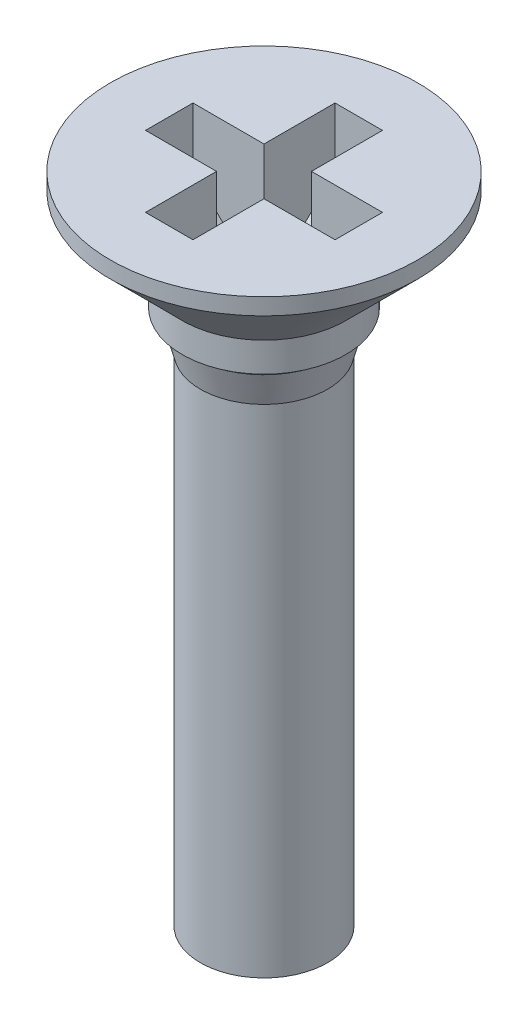
ISO-10303-21;
HEADER;
FILE_DESCRIPTION(('STEP AP214'),'2;1');
FILE_NAME('part.step','',(''),(''),'','','');
FILE_SCHEMA(('AUTOMOTIVE_DESIGN { 1 0 10303 214 1 1 1 1 }'));
ENDSEC;
DATA;
#1=APPLICATION_CONTEXT('core data for automotive mechanical design processes');
#2=APPLICATION_PROTOCOL_DEFINITION('international standard','automotive_design',2000,#1);
#3=PRODUCT_CONTEXT('',#1,'mechanical');
#4=PRODUCT('Part','Part','',(#3));
#5=PRODUCT_RELATED_PRODUCT_CATEGORY('part','',(#4));
#6=PRODUCT_DEFINITION_FORMATION('','',#4);
#7=PRODUCT_DEFINITION_CONTEXT('part definition',#1,'design');
#8=PRODUCT_DEFINITION('design','',#6,#7);
#9=PRODUCT_DEFINITION_SHAPE('','',#8);
#10=(LENGTH_UNIT() NAMED_UNIT(*) SI_UNIT(.MILLI.,.METRE.));
#11=(NAMED_UNIT(*) PLANE_ANGLE_UNIT() SI_UNIT($,.RADIAN.));
#12=(NAMED_UNIT(*) SI_UNIT($,.STERADIAN.) SOLID_ANGLE_UNIT());
#13=UNCERTAINTY_MEASURE_WITH_UNIT(LENGTH_MEASURE(1.E-05),#10,'distance_accuracy_value','');
#14=(GEOMETRIC_REPRESENTATION_CONTEXT(3) GLOBAL_UNCERTAINTY_ASSIGNED_CONTEXT((#13)) GLOBAL_UNIT_ASSIGNED_CONTEXT((#10,
#11,#12)) REPRESENTATION_CONTEXT('',''));
#15=CARTESIAN_POINT('',(0.,0.,0.));
#16=DIRECTION('',(0.,0.,1.));
#17=DIRECTION('',(1.,0.,0.));
#18=AXIS2_PLACEMENT_3D('',#15,#16,#17);
#19=CARTESIAN_POINT('',(0.,-2.35,-0.363));
#20=DIRECTION('',(0.,0.,-1.));
#21=DIRECTION('',(-1.,0.,0.));
#22=AXIS2_PLACEMENT_3D('',#19,#20,#21);
#23=PLANE('',#22);
#24=DIRECTION('',(0.,1.,0.));
#25=VECTOR('',#24,1.);
#26=CARTESIAN_POINT('',(0.363,-2.35,-0.363));
#27=LINE('',#26,#25);
#28=CARTESIAN_POINT('',(0.363,-1.8,-0.363));
#29=VERTEX_POINT('',#28);
#30=CARTESIAN_POINT('',(0.363,0.,-0.363));
#31=VERTEX_POINT('',#30);
#32=EDGE_CURVE('E196',#29,#31,#27,.T.);
#33=ORIENTED_EDGE('',*,*,#32,.F.);
#34=DIRECTION('',(1.,0.,0.));
#35=VECTOR('',#34,1.);
#36=CARTESIAN_POINT('',(-0.550000000000001,-1.8,-0.363));
#37=LINE('',#36,#35);
#38=CARTESIAN_POINT('',(0.550000000000001,-1.8,-0.363));
#39=VERTEX_POINT('',#38);
#40=EDGE_CURVE('E231',#29,#39,#37,.T.);
#41=ORIENTED_EDGE('',*,*,#40,.T.);
#42=DIRECTION('',(0.707106781186547,0.707106781186548,0.));
#43=VECTOR('',#42,1.);
#44=CARTESIAN_POINT('',(1.45,-0.9,-0.363));
#45=LINE('',#44,#43);
#46=CARTESIAN_POINT('',(1.45,-0.9,-0.363));
#47=VERTEX_POINT('',#46);
#48=EDGE_CURVE('E235',#39,#47,#45,.T.);
#49=ORIENTED_EDGE('',*,*,#48,.T.);
#50=DIRECTION('',(0.,1.,0.));
#51=VECTOR('',#50,1.);
#52=CARTESIAN_POINT('',(1.45,0.,-0.363));
#53=LINE('',#52,#51);
#54=CARTESIAN_POINT('',(1.45,0.,-0.363));
#55=VERTEX_POINT('',#54);
#56=EDGE_CURVE('E238',#47,#55,#53,.T.);
#57=ORIENTED_EDGE('',*,*,#56,.T.);
#58=DIRECTION('',(-1.,0.,0.));
#59=VECTOR('',#58,1.);
#60=CARTESIAN_POINT('',(1.45,0.,-0.363));
#61=LINE('',#60,#59);
#62=EDGE_CURVE('E242',#55,#31,#61,.T.);
#63=ORIENTED_EDGE('',*,*,#62,.T.);
#64=EDGE_LOOP('',(#33,#41,#49,#57,#63));
#65=FACE_BOUND('',#64,.T.);
#66=ADVANCED_FACE('F34',(#65),#23,.F.);
#67=CARTESIAN_POINT('',(0.,-2.35,0.363));
#68=DIRECTION('',(0.,0.,-1.));
#69=DIRECTION('',(-1.,0.,0.));
#70=AXIS2_PLACEMENT_3D('',#67,#68,#69);
#71=PLANE('',#70);
#72=DIRECTION('',(1.,0.,0.));
#73=VECTOR('',#72,1.);
#74=CARTESIAN_POINT('',(-0.550000000000001,-1.8,0.363));
#75=LINE('',#74,#73);
#76=CARTESIAN_POINT('',(0.363,-1.8,0.363));
#77=VERTEX_POINT('',#76);
#78=CARTESIAN_POINT('',(0.550000000000001,-1.8,0.363));
#79=VERTEX_POINT('',#78);
#80=EDGE_CURVE('E213',#77,#79,#75,.T.);
#81=ORIENTED_EDGE('',*,*,#80,.F.);
#82=DIRECTION('',(0.,1.,0.));
#83=VECTOR('',#82,1.);
#84=CARTESIAN_POINT('',(0.363,-2.35,0.363));
#85=LINE('',#84,#83);
#86=CARTESIAN_POINT('',(0.363,0.,0.363));
#87=VERTEX_POINT('',#86);
#88=EDGE_CURVE('E42',#77,#87,#85,.T.);
#89=ORIENTED_EDGE('',*,*,#88,.T.);
#90=DIRECTION('',(-1.,0.,0.));
#91=VECTOR('',#90,1.);
#92=CARTESIAN_POINT('',(1.45,0.,0.363));
#93=LINE('',#92,#91);
#94=CARTESIAN_POINT('',(1.45,0.,0.363));
#95=VERTEX_POINT('',#94);
#96=EDGE_CURVE('E222',#95,#87,#93,.T.);
#97=ORIENTED_EDGE('',*,*,#96,.F.);
#98=DIRECTION('',(0.,1.,0.));
#99=VECTOR('',#98,1.);
#100=CARTESIAN_POINT('',(1.45,0.,0.363));
#101=LINE('',#100,#99);
#102=CARTESIAN_POINT('',(1.45,-0.9,0.363));
#103=VERTEX_POINT('',#102);
#104=EDGE_CURVE('E219',#103,#95,#101,.T.);
#105=ORIENTED_EDGE('',*,*,#104,.F.);
#106=DIRECTION('',(0.707106781186547,0.707106781186548,0.));
#107=VECTOR('',#106,1.);
#108=CARTESIAN_POINT('',(1.45,-0.9,0.363));
#109=LINE('',#108,#107);
#110=EDGE_CURVE('E216',#79,#103,#109,.T.);
#111=ORIENTED_EDGE('',*,*,#110,.F.);
#112=EDGE_LOOP('',(#81,#89,#97,#105,#111));
#113=FACE_BOUND('',#112,.T.);
#114=ADVANCED_FACE('F288',(#113),#71,.T.);
#115=CARTESIAN_POINT('',(0.974000000000002,-10.,0.));
#116=DIRECTION('',(0.,1.,0.));
#117=DIRECTION('',(-1.,0.,0.));
#118=AXIS2_PLACEMENT_3D('',#115,#116,#117);
#119=PLANE('',#118);
#120=CARTESIAN_POINT('',(0.,-10.,0.));
#121=DIRECTION('',(0.,1.,0.));
#122=DIRECTION('',(-1.,0.,0.));
#123=AXIS2_PLACEMENT_3D('',#120,#121,#122);
#124=CIRCLE('',#123,0.974000000000001);
#125=CARTESIAN_POINT('',(-0.974,-10.,0.));
#126=VERTEX_POINT('',#125);
#127=EDGE_CURVE('E284',#126,#126,#124,.T.);
#128=ORIENTED_EDGE('',*,*,#127,.F.);
#129=EDGE_LOOP('',(#128));
#130=FACE_BOUND('',#129,.T.);
#131=ADVANCED_FACE('F36',(#130),#119,.F.);
#132=CARTESIAN_POINT('',(0.,0.,0.));
#133=DIRECTION('',(0.,1.,0.));
#134=DIRECTION('',(-1.,0.,0.));
#135=AXIS2_PLACEMENT_3D('',#132,#133,#134);
#136=CYLINDRICAL_SURFACE('',#135,0.974);
#137=CARTESIAN_POINT('',(0.,-2.4,0.));
#138=DIRECTION('',(0.,1.,0.));
#139=DIRECTION('',(-1.,0.,0.));
#140=AXIS2_PLACEMENT_3D('',#137,#138,#139);
#141=CIRCLE('',#140,0.974);
#142=CARTESIAN_POINT('',(-0.974,-2.4,0.));
#143=VERTEX_POINT('',#142);
#144=EDGE_CURVE('E281',#143,#143,#141,.T.);
#145=ORIENTED_EDGE('',*,*,#144,.F.);
#146=EDGE_LOOP('',(#145));
#147=FACE_BOUND('',#146,.T.);
#148=ORIENTED_EDGE('',*,*,#127,.T.);
#149=EDGE_LOOP('',(#148));
#150=FACE_BOUND('',#149,.T.);
#151=ADVANCED_FACE('F396',(#147,#150),#136,.T.);
#152=CARTESIAN_POINT('',(0.,-2.4,0.));
#153=DIRECTION('',(0.,1.,0.));
#154=DIRECTION('',(-1.,0.,0.));
#155=AXIS2_PLACEMENT_3D('',#152,#153,#154);
#156=CONICAL_SURFACE('',#155,0.974,0.26179938779915);
#157=CARTESIAN_POINT('',(0.,-1.91483339501605,0.));
#158=DIRECTION('',(0.,1.,0.));
#159=DIRECTION('',(-1.,0.,0.));
#160=AXIS2_PLACEMENT_3D('',#157,#158,#159);
#161=CIRCLE('',#160,1.104);
#162=CARTESIAN_POINT('',(-1.104,-1.91483339501605,0.));
#163=VERTEX_POINT('',#162);
#164=EDGE_CURVE('E278',#163,#163,#161,.T.);
#165=ORIENTED_EDGE('',*,*,#164,.F.);
#166=EDGE_LOOP('',(#165));
#167=FACE_BOUND('',#166,.T.);
#168=ORIENTED_EDGE('',*,*,#144,.T.);
#169=EDGE_LOOP('',(#168));
#170=FACE_BOUND('',#169,.T.);
#171=ADVANCED_FACE('F393',(#167,#170),#156,.T.);
#172=CARTESIAN_POINT('',(0.,0.,0.));
#173=DIRECTION('',(0.,1.,0.));
#174=DIRECTION('',(-1.,0.,0.));
#175=AXIS2_PLACEMENT_3D('',#172,#173,#174);
#176=CYLINDRICAL_SURFACE('',#175,1.104);
#177=CARTESIAN_POINT('',(0.,-1.804,0.));
#178=DIRECTION('',(0.,1.,0.));
#179=DIRECTION('',(-1.,0.,0.));
#180=AXIS2_PLACEMENT_3D('',#177,#178,#179);
#181=CIRCLE('',#180,1.104);
#182=CARTESIAN_POINT('',(-1.104,-1.804,0.));
#183=VERTEX_POINT('',#182);
#184=EDGE_CURVE('E275',#183,#183,#181,.T.);
#185=ORIENTED_EDGE('',*,*,#184,.F.);
#186=EDGE_LOOP('',(#185));
#187=FACE_BOUND('',#186,.T.);
#188=ORIENTED_EDGE('',*,*,#164,.T.);
#189=EDGE_LOOP('',(#188));
#190=FACE_BOUND('',#189,.T.);
#191=ADVANCED_FACE('F389',(#187,#190),#176,.T.);
#192=CARTESIAN_POINT('',(1.25,-1.804,0.));
#193=DIRECTION('',(0.,1.,0.));
#194=DIRECTION('',(-1.,0.,0.));
#195=AXIS2_PLACEMENT_3D('',#192,#193,#194);
#196=PLANE('',#195);
#197=CARTESIAN_POINT('',(0.,-1.804,0.));
#198=DIRECTION('',(0.,1.,0.));
#199=DIRECTION('',(-1.,0.,0.));
#200=AXIS2_PLACEMENT_3D('',#197,#198,#199);
#201=CIRCLE('',#200,1.25);
#202=CARTESIAN_POINT('',(-1.25,-1.804,0.));
#203=VERTEX_POINT('',#202);
#204=EDGE_CURVE('E272',#203,#203,#201,.T.);
#205=ORIENTED_EDGE('',*,*,#204,.F.);
#206=EDGE_LOOP('',(#205));
#207=FACE_BOUND('',#206,.T.);
#208=ORIENTED_EDGE('',*,*,#184,.T.);
#209=EDGE_LOOP('',(#208));
#210=FACE_BOUND('',#209,.T.);
#211=ADVANCED_FACE('F385',(#207,#210),#196,.F.);
#212=CARTESIAN_POINT('',(0.,0.,0.));
#213=DIRECTION('',(0.,1.,0.));
#214=DIRECTION('',(-1.,0.,0.));
#215=AXIS2_PLACEMENT_3D('',#212,#213,#214);
#216=CYLINDRICAL_SURFACE('',#215,1.25);
#217=CARTESIAN_POINT('',(0.,-1.354,0.));
#218=DIRECTION('',(0.,1.,0.));
#219=DIRECTION('',(-1.,0.,0.));
#220=AXIS2_PLACEMENT_3D('',#217,#218,#219);
#221=CIRCLE('',#220,1.25);
#222=CARTESIAN_POINT('',(-1.25,-1.354,0.));
#223=VERTEX_POINT('',#222);
#224=EDGE_CURVE('E269',#223,#223,#221,.T.);
#225=ORIENTED_EDGE('',*,*,#224,.F.);
#226=EDGE_LOOP('',(#225));
#227=FACE_BOUND('',#226,.T.);
#228=ORIENTED_EDGE('',*,*,#204,.T.);
#229=EDGE_LOOP('',(#228));
#230=FACE_BOUND('',#229,.T.);
#231=ADVANCED_FACE('F381',(#227,#230),#216,.T.);
#232=CARTESIAN_POINT('',(0.,-1.354,0.));
#233=DIRECTION('',(0.,1.,0.));
#234=DIRECTION('',(-1.,0.,0.));
#235=AXIS2_PLACEMENT_3D('',#232,#233,#234);
#236=CONICAL_SURFACE('',#235,1.25,0.78539816339745);
#237=CARTESIAN_POINT('',(0.,-0.254000000000005,0.));
#238=DIRECTION('',(0.,1.,0.));
#239=DIRECTION('',(-1.,0.,0.));
#240=AXIS2_PLACEMENT_3D('',#237,#238,#239);
#241=CIRCLE('',#240,2.35);
#242=CARTESIAN_POINT('',(-2.35,-0.254000000000005,0.));
#243=VERTEX_POINT('',#242);
#244=EDGE_CURVE('E266',#243,#243,#241,.T.);
#245=ORIENTED_EDGE('',*,*,#244,.F.);
#246=EDGE_LOOP('',(#245));
#247=FACE_BOUND('',#246,.T.);
#248=ORIENTED_EDGE('',*,*,#224,.T.);
#249=EDGE_LOOP('',(#248));
#250=FACE_BOUND('',#249,.T.);
#251=ADVANCED_FACE('F377',(#247,#250),#236,.T.);
#252=CARTESIAN_POINT('',(0.,0.,0.));
#253=DIRECTION('',(0.,1.,0.));
#254=DIRECTION('',(-1.,0.,0.));
#255=AXIS2_PLACEMENT_3D('',#252,#253,#254);
#256=CYLINDRICAL_SURFACE('',#255,2.35);
#257=CARTESIAN_POINT('',(0.,0.,0.));
#258=DIRECTION('',(0.,1.,0.));
#259=DIRECTION('',(-1.,0.,0.));
#260=AXIS2_PLACEMENT_3D('',#257,#258,#259);
#261=CIRCLE('',#260,2.35);
#262=CARTESIAN_POINT('',(-2.35,0.,0.));
#263=VERTEX_POINT('',#262);
#264=EDGE_CURVE('E251',#263,#263,#261,.T.);
#265=ORIENTED_EDGE('',*,*,#264,.F.);
#266=EDGE_LOOP('',(#265));
#267=FACE_BOUND('',#266,.T.);
#268=ORIENTED_EDGE('',*,*,#244,.T.);
#269=EDGE_LOOP('',(#268));
#270=FACE_BOUND('',#269,.T.);
#271=ADVANCED_FACE('F374',(#267,#270),#256,.T.);
#272=CARTESIAN_POINT('',(0.,0.,0.));
#273=DIRECTION('',(0.,-1.,0.));
#274=DIRECTION('',(1.,0.,0.));
#275=AXIS2_PLACEMENT_3D('',#272,#273,#274);
#276=PLANE('',#275);
#277=DIRECTION('',(1.,0.,0.));
#278=VECTOR('',#277,1.);
#279=CARTESIAN_POINT('',(-0.363,0.,1.45));
#280=LINE('',#279,#278);
#281=CARTESIAN_POINT('',(-0.363,0.,1.45));
#282=VERTEX_POINT('',#281);
#283=CARTESIAN_POINT('',(0.363,0.,1.45));
#284=VERTEX_POINT('',#283);
#285=EDGE_CURVE('E197',#282,#284,#280,.T.);
#286=ORIENTED_EDGE('',*,*,#285,.F.);
#287=DIRECTION('',(0.,0.,1.));
#288=VECTOR('',#287,1.);
#289=CARTESIAN_POINT('',(-0.363,0.,-1.45));
#290=LINE('',#289,#288);
#291=CARTESIAN_POINT('',(-0.363,0.,0.363));
#292=VERTEX_POINT('',#291);
#293=EDGE_CURVE('E190',#292,#282,#290,.T.);
#294=ORIENTED_EDGE('',*,*,#293,.F.);
#295=CARTESIAN_POINT('',(-1.45,0.,0.363));
#296=VERTEX_POINT('',#295);
#297=EDGE_CURVE('E221',#292,#296,#93,.T.);
#298=ORIENTED_EDGE('',*,*,#297,.T.);
#299=DIRECTION('',(0.,0.,1.));
#300=VECTOR('',#299,1.);
#301=CARTESIAN_POINT('',(-1.45,0.,-0.363));
#302=LINE('',#301,#300);
#303=CARTESIAN_POINT('',(-1.45,0.,-0.363));
#304=VERTEX_POINT('',#303);
#305=EDGE_CURVE('E252',#304,#296,#302,.T.);
#306=ORIENTED_EDGE('',*,*,#305,.F.);
#307=CARTESIAN_POINT('',(-0.363,0.,-0.363));
#308=VERTEX_POINT('',#307);
#309=EDGE_CURVE('E241',#308,#304,#61,.T.);
#310=ORIENTED_EDGE('',*,*,#309,.F.);
#311=CARTESIAN_POINT('',(-0.363,0.,-1.45));
#312=VERTEX_POINT('',#311);
#313=EDGE_CURVE('E191',#312,#308,#290,.T.);
#314=ORIENTED_EDGE('',*,*,#313,.F.);
#315=DIRECTION('',(1.,0.,0.));
#316=VECTOR('',#315,1.);
#317=CARTESIAN_POINT('',(-0.363,0.,-1.45));
#318=LINE('',#317,#316);
#319=CARTESIAN_POINT('',(0.363,0.,-1.45));
#320=VERTEX_POINT('',#319);
#321=EDGE_CURVE('E199',#312,#320,#318,.T.);
#322=ORIENTED_EDGE('',*,*,#321,.T.);
#323=DIRECTION('',(0.,0.,1.));
#324=VECTOR('',#323,1.);
#325=CARTESIAN_POINT('',(0.363,0.,-1.45));
#326=LINE('',#325,#324);
#327=EDGE_CURVE('E175',#320,#31,#326,.T.);
#328=ORIENTED_EDGE('',*,*,#327,.T.);
#329=ORIENTED_EDGE('',*,*,#62,.F.);
#330=DIRECTION('',(0.,0.,1.));
#331=VECTOR('',#330,1.);
#332=CARTESIAN_POINT('',(1.45,0.,-0.363));
#333=LINE('',#332,#331);
#334=EDGE_CURVE('E255',#55,#95,#333,.T.);
#335=ORIENTED_EDGE('',*,*,#334,.T.);
#336=ORIENTED_EDGE('',*,*,#96,.T.);
#337=EDGE_CURVE('E57',#87,#284,#326,.T.);
#338=ORIENTED_EDGE('',*,*,#337,.T.);
#339=EDGE_LOOP('',(#286,#294,#298,#306,#310,#314,#322,#328,#329,#335,#336,#338));
#340=FACE_BOUND('',#339,.T.);
#341=ORIENTED_EDGE('',*,*,#264,.T.);
#342=EDGE_LOOP('',(#341));
#343=FACE_BOUND('',#342,.T.);
#344=ADVANCED_FACE('F293',(#340,#343),#276,.F.);
#345=CARTESIAN_POINT('',(-1.45,-0.9,-0.363));
#346=DIRECTION('',(-0.707106781186548,-0.707106781186547,0.));
#347=DIRECTION('',(0.707106781186547,-0.707106781186548,0.));
#348=AXIS2_PLACEMENT_3D('',#345,#346,#347);
#349=PLANE('',#348);
#350=DIRECTION('',(0.,0.,1.));
#351=VECTOR('',#350,1.);
#352=CARTESIAN_POINT('',(-0.550000000000001,-1.8,-0.363));
#353=LINE('',#352,#351);
#354=CARTESIAN_POINT('',(-0.550000000000001,-1.8,-0.363));
#355=VERTEX_POINT('',#354);
#356=CARTESIAN_POINT('',(-0.550000000000001,-1.8,0.363));
#357=VERTEX_POINT('',#356);
#358=EDGE_CURVE('E248',#355,#357,#353,.T.);
#359=ORIENTED_EDGE('',*,*,#358,.F.);
#360=DIRECTION('',(0.707106781186547,-0.707106781186548,0.));
#361=VECTOR('',#360,1.);
#362=CARTESIAN_POINT('',(-1.45,-0.9,-0.363));
#363=LINE('',#362,#361);
#364=CARTESIAN_POINT('',(-1.45,-0.9,-0.363));
#365=VERTEX_POINT('',#364);
#366=EDGE_CURVE('E228',#365,#355,#363,.T.);
#367=ORIENTED_EDGE('',*,*,#366,.F.);
#368=DIRECTION('',(0.,0.,1.));
#369=VECTOR('',#368,1.);
#370=CARTESIAN_POINT('',(-1.45,-0.9,-0.363));
#371=LINE('',#370,#369);
#372=CARTESIAN_POINT('',(-1.45,-0.9,0.363));
#373=VERTEX_POINT('',#372);
#374=EDGE_CURVE('E249',#365,#373,#371,.T.);
#375=ORIENTED_EDGE('',*,*,#374,.T.);
#376=DIRECTION('',(0.707106781186547,-0.707106781186548,0.));
#377=VECTOR('',#376,1.);
#378=CARTESIAN_POINT('',(-1.45,-0.9,0.363));
#379=LINE('',#378,#377);
#380=EDGE_CURVE('E210',#373,#357,#379,.T.);
#381=ORIENTED_EDGE('',*,*,#380,.T.);
#382=EDGE_LOOP('',(#359,#367,#375,#381));
#383=FACE_BOUND('',#382,.T.);
#384=ADVANCED_FACE('F326',(#383),#349,.F.);
#385=CARTESIAN_POINT('',(-1.45,0.,-0.363));
#386=DIRECTION('',(-1.,0.,0.));
#387=DIRECTION('',(0.,0.,1.));
#388=AXIS2_PLACEMENT_3D('',#385,#386,#387);
#389=PLANE('',#388);
#390=ORIENTED_EDGE('',*,*,#374,.F.);
#391=DIRECTION('',(0.,-1.,0.));
#392=VECTOR('',#391,1.);
#393=CARTESIAN_POINT('',(-1.45,0.,-0.363));
#394=LINE('',#393,#392);
#395=EDGE_CURVE('E245',#304,#365,#394,.T.);
#396=ORIENTED_EDGE('',*,*,#395,.F.);
#397=ORIENTED_EDGE('',*,*,#305,.T.);
#398=DIRECTION('',(0.,-1.,0.));
#399=VECTOR('',#398,1.);
#400=CARTESIAN_POINT('',(-1.45,0.,0.363));
#401=LINE('',#400,#399);
#402=EDGE_CURVE('E225',#296,#373,#401,.T.);
#403=ORIENTED_EDGE('',*,*,#402,.T.);
#404=EDGE_LOOP('',(#390,#396,#397,#403));
#405=FACE_BOUND('',#404,.T.);
#406=ADVANCED_FACE('F371',(#405),#389,.F.);
#407=CARTESIAN_POINT('',(1.45,0.,-0.363));
#408=DIRECTION('',(1.,0.,0.));
#409=DIRECTION('',(0.,0.,-1.));
#410=AXIS2_PLACEMENT_3D('',#407,#408,#409);
#411=PLANE('',#410);
#412=ORIENTED_EDGE('',*,*,#334,.F.);
#413=ORIENTED_EDGE('',*,*,#56,.F.);
#414=DIRECTION('',(0.,0.,1.));
#415=VECTOR('',#414,1.);
#416=CARTESIAN_POINT('',(1.45,-0.9,-0.363));
#417=LINE('',#416,#415);
#418=EDGE_CURVE('E258',#47,#103,#417,.T.);
#419=ORIENTED_EDGE('',*,*,#418,.T.);
#420=ORIENTED_EDGE('',*,*,#104,.T.);
#421=EDGE_LOOP('',(#412,#413,#419,#420));
#422=FACE_BOUND('',#421,.T.);
#423=ADVANCED_FACE('F298',(#422),#411,.F.);
#424=CARTESIAN_POINT('',(1.45,-0.9,-0.363));
#425=DIRECTION('',(0.707106781186548,-0.707106781186547,0.));
#426=DIRECTION('',(0.707106781186547,0.707106781186548,0.));
#427=AXIS2_PLACEMENT_3D('',#424,#425,#426);
#428=PLANE('',#427);
#429=ORIENTED_EDGE('',*,*,#418,.F.);
#430=ORIENTED_EDGE('',*,*,#48,.F.);
#431=DIRECTION('',(0.,0.,1.));
#432=VECTOR('',#431,1.);
#433=CARTESIAN_POINT('',(0.550000000000001,-1.8,-0.363));
#434=LINE('',#433,#432);
#435=EDGE_CURVE('E260',#39,#79,#434,.T.);
#436=ORIENTED_EDGE('',*,*,#435,.T.);
#437=ORIENTED_EDGE('',*,*,#110,.T.);
#438=EDGE_LOOP('',(#429,#430,#436,#437));
#439=FACE_BOUND('',#438,.T.);
#440=ADVANCED_FACE('F304',(#439),#428,.F.);
#441=CARTESIAN_POINT('',(-0.550000000000001,-1.8,-0.363));
#442=DIRECTION('',(0.,-1.,0.));
#443=DIRECTION('',(0.,0.,-1.));
#444=AXIS2_PLACEMENT_3D('',#441,#442,#443);
#445=PLANE('',#444);
#446=CARTESIAN_POINT('',(-0.363,-1.8,0.363));
#447=VERTEX_POINT('',#446);
#448=EDGE_CURVE('E214',#357,#447,#75,.T.);
#449=ORIENTED_EDGE('',*,*,#448,.T.);
#450=DIRECTION('',(0.,0.,-1.));
#451=VECTOR('',#450,1.);
#452=CARTESIAN_POINT('',(-0.363,-1.8,0.550000000000001));
#453=LINE('',#452,#451);
#454=CARTESIAN_POINT('',(-0.363,-1.8,0.550000000000001));
#455=VERTEX_POINT('',#454);
#456=EDGE_CURVE('E153',#455,#447,#453,.T.);
#457=ORIENTED_EDGE('',*,*,#456,.F.);
#458=DIRECTION('',(1.,0.,0.));
#459=VECTOR('',#458,1.);
#460=CARTESIAN_POINT('',(-0.363,-1.8,0.550000000000001));
#461=LINE('',#460,#459);
#462=CARTESIAN_POINT('',(0.363,-1.8,0.550000000000001));
#463=VERTEX_POINT('',#462);
#464=EDGE_CURVE('E147',#455,#463,#461,.T.);
#465=ORIENTED_EDGE('',*,*,#464,.T.);
#466=DIRECTION('',(0.,0.,-1.));
#467=VECTOR('',#466,1.);
#468=CARTESIAN_POINT('',(0.363,-1.8,0.550000000000001));
#469=LINE('',#468,#467);
#470=EDGE_CURVE('E151',#463,#77,#469,.T.);
#471=ORIENTED_EDGE('',*,*,#470,.T.);
#472=ORIENTED_EDGE('',*,*,#80,.T.);
#473=ORIENTED_EDGE('',*,*,#435,.F.);
#474=ORIENTED_EDGE('',*,*,#40,.F.);
#475=CARTESIAN_POINT('',(0.363,-1.8,-0.550000000000001));
#476=VERTEX_POINT('',#475);
#477=EDGE_CURVE('E49',#29,#476,#469,.T.);
#478=ORIENTED_EDGE('',*,*,#477,.T.);
#479=DIRECTION('',(1.,0.,0.));
#480=VECTOR('',#479,1.);
#481=CARTESIAN_POINT('',(-0.363,-1.8,-0.550000000000001));
#482=LINE('',#481,#480);
#483=CARTESIAN_POINT('',(-0.363,-1.8,-0.550000000000001));
#484=VERTEX_POINT('',#483);
#485=EDGE_CURVE('E158',#484,#476,#482,.T.);
#486=ORIENTED_EDGE('',*,*,#485,.F.);
#487=CARTESIAN_POINT('',(-0.363,-1.8,-0.363));
#488=VERTEX_POINT('',#487);
#489=EDGE_CURVE('E182',#488,#484,#453,.T.);
#490=ORIENTED_EDGE('',*,*,#489,.F.);
#491=EDGE_CURVE('E232',#355,#488,#37,.T.);
#492=ORIENTED_EDGE('',*,*,#491,.F.);
#493=ORIENTED_EDGE('',*,*,#358,.T.);
#494=EDGE_LOOP('',(#449,#457,#465,#471,#472,#473,#474,#478,#486,#490,#492,#493));
#495=FACE_BOUND('',#494,.T.);
#496=ADVANCED_FACE('F150',(#495),#445,.F.);
#497=ORIENTED_EDGE('',*,*,#491,.T.);
#498=DIRECTION('',(0.,1.,0.));
#499=VECTOR('',#498,1.);
#500=CARTESIAN_POINT('',(-0.363,-2.35,-0.363));
#501=LINE('',#500,#499);
#502=EDGE_CURVE('E207',#488,#308,#501,.T.);
#503=ORIENTED_EDGE('',*,*,#502,.T.);
#504=ORIENTED_EDGE('',*,*,#309,.T.);
#505=ORIENTED_EDGE('',*,*,#395,.T.);
#506=ORIENTED_EDGE('',*,*,#366,.T.);
#507=EDGE_LOOP('',(#497,#503,#504,#505,#506));
#508=FACE_BOUND('',#507,.T.);
#509=ADVANCED_FACE('F321',(#508),#23,.F.);
#510=DIRECTION('',(0.,1.,0.));
#511=VECTOR('',#510,1.);
#512=CARTESIAN_POINT('',(-0.363,-2.35,0.363));
#513=LINE('',#512,#511);
#514=EDGE_CURVE('E11',#447,#292,#513,.T.);
#515=ORIENTED_EDGE('',*,*,#514,.F.);
#516=ORIENTED_EDGE('',*,*,#448,.F.);
#517=ORIENTED_EDGE('',*,*,#380,.F.);
#518=ORIENTED_EDGE('',*,*,#402,.F.);
#519=ORIENTED_EDGE('',*,*,#297,.F.);
#520=EDGE_LOOP('',(#515,#516,#517,#518,#519));
#521=FACE_BOUND('',#520,.T.);
#522=ADVANCED_FACE('F331',(#521),#71,.T.);
#523=CARTESIAN_POINT('',(-0.363,-0.9,1.45));
#524=DIRECTION('',(0.,-0.707106781186547,0.707106781186548));
#525=DIRECTION('',(0.,-0.707106781186548,-0.707106781186547));
#526=AXIS2_PLACEMENT_3D('',#523,#524,#525);
#527=PLANE('',#526);
#528=ORIENTED_EDGE('',*,*,#464,.F.);
#529=DIRECTION('',(0.,-0.707106781186548,-0.707106781186547));
#530=VECTOR('',#529,1.);
#531=CARTESIAN_POINT('',(-0.363,-0.9,1.45));
#532=LINE('',#531,#530);
#533=CARTESIAN_POINT('',(-0.363,-0.9,1.45));
#534=VERTEX_POINT('',#533);
#535=EDGE_CURVE('E180',#534,#455,#532,.T.);
#536=ORIENTED_EDGE('',*,*,#535,.F.);
#537=DIRECTION('',(1.,0.,0.));
#538=VECTOR('',#537,1.);
#539=CARTESIAN_POINT('',(-0.363,-0.9,1.45));
#540=LINE('',#539,#538);
#541=CARTESIAN_POINT('',(0.363,-0.9,1.45));
#542=VERTEX_POINT('',#541);
#543=EDGE_CURVE('E167',#534,#542,#540,.T.);
#544=ORIENTED_EDGE('',*,*,#543,.T.);
#545=DIRECTION('',(0.,-0.707106781186548,-0.707106781186547));
#546=VECTOR('',#545,1.);
#547=CARTESIAN_POINT('',(0.363,-0.9,1.45));
#548=LINE('',#547,#546);
#549=EDGE_CURVE('E163',#542,#463,#548,.T.);
#550=ORIENTED_EDGE('',*,*,#549,.T.);
#551=EDGE_LOOP('',(#528,#536,#544,#550));
#552=FACE_BOUND('',#551,.T.);
#553=ADVANCED_FACE('F166',(#552),#527,.F.);
#554=CARTESIAN_POINT('',(-0.363,-2.35,0.));
#555=DIRECTION('',(-1.,0.,0.));
#556=DIRECTION('',(0.,0.,1.));
#557=AXIS2_PLACEMENT_3D('',#554,#555,#556);
#558=PLANE('',#557);
#559=ORIENTED_EDGE('',*,*,#514,.T.);
#560=ORIENTED_EDGE('',*,*,#293,.T.);
#561=DIRECTION('',(0.,-1.,0.));
#562=VECTOR('',#561,1.);
#563=CARTESIAN_POINT('',(-0.363,0.,1.45));
#564=LINE('',#563,#562);
#565=EDGE_CURVE('E159',#282,#534,#564,.T.);
#566=ORIENTED_EDGE('',*,*,#565,.T.);
#567=ORIENTED_EDGE('',*,*,#535,.T.);
#568=ORIENTED_EDGE('',*,*,#456,.T.);
#569=EDGE_LOOP('',(#559,#560,#566,#567,#568));
#570=FACE_BOUND('',#569,.T.);
#571=ADVANCED_FACE('F336',(#570),#558,.F.);
#572=CARTESIAN_POINT('',(0.363,-2.35,0.));
#573=DIRECTION('',(-1.,0.,0.));
#574=DIRECTION('',(0.,0.,1.));
#575=AXIS2_PLACEMENT_3D('',#572,#573,#574);
#576=PLANE('',#575);
#577=ORIENTED_EDGE('',*,*,#470,.F.);
#578=ORIENTED_EDGE('',*,*,#549,.F.);
#579=DIRECTION('',(0.,-1.,0.));
#580=VECTOR('',#579,1.);
#581=CARTESIAN_POINT('',(0.363,0.,1.45));
#582=LINE('',#581,#580);
#583=EDGE_CURVE('E178',#284,#542,#582,.T.);
#584=ORIENTED_EDGE('',*,*,#583,.F.);
#585=ORIENTED_EDGE('',*,*,#337,.F.);
#586=ORIENTED_EDGE('',*,*,#88,.F.);
#587=EDGE_LOOP('',(#577,#578,#584,#585,#586));
#588=FACE_BOUND('',#587,.T.);
#589=ADVANCED_FACE('F162',(#588),#576,.T.);
#590=CARTESIAN_POINT('',(-0.363,0.,1.45));
#591=DIRECTION('',(0.,0.,1.));
#592=DIRECTION('',(1.,0.,0.));
#593=AXIS2_PLACEMENT_3D('',#590,#591,#592);
#594=PLANE('',#593);
#595=ORIENTED_EDGE('',*,*,#543,.F.);
#596=ORIENTED_EDGE('',*,*,#565,.F.);
#597=ORIENTED_EDGE('',*,*,#285,.T.);
#598=ORIENTED_EDGE('',*,*,#583,.T.);
#599=EDGE_LOOP('',(#595,#596,#597,#598));
#600=FACE_BOUND('',#599,.T.);
#601=ADVANCED_FACE('F340',(#600),#594,.F.);
#602=ORIENTED_EDGE('',*,*,#489,.T.);
#603=DIRECTION('',(0.,0.707106781186548,-0.707106781186547));
#604=VECTOR('',#603,1.);
#605=CARTESIAN_POINT('',(-0.363,-0.9,-1.45));
#606=LINE('',#605,#604);
#607=CARTESIAN_POINT('',(-0.363,-0.9,-1.45));
#608=VERTEX_POINT('',#607);
#609=EDGE_CURVE('E184',#484,#608,#606,.T.);
#610=ORIENTED_EDGE('',*,*,#609,.T.);
#611=DIRECTION('',(0.,1.,0.));
#612=VECTOR('',#611,1.);
#613=CARTESIAN_POINT('',(-0.363,0.,-1.45));
#614=LINE('',#613,#612);
#615=EDGE_CURVE('E187',#608,#312,#614,.T.);
#616=ORIENTED_EDGE('',*,*,#615,.T.);
#617=ORIENTED_EDGE('',*,*,#313,.T.);
#618=ORIENTED_EDGE('',*,*,#502,.F.);
#619=EDGE_LOOP('',(#602,#610,#616,#617,#618));
#620=FACE_BOUND('',#619,.T.);
#621=ADVANCED_FACE('F318',(#620),#558,.F.);
#622=ORIENTED_EDGE('',*,*,#32,.T.);
#623=ORIENTED_EDGE('',*,*,#327,.F.);
#624=DIRECTION('',(0.,1.,0.));
#625=VECTOR('',#624,1.);
#626=CARTESIAN_POINT('',(0.363,0.,-1.45));
#627=LINE('',#626,#625);
#628=CARTESIAN_POINT('',(0.363,-0.9,-1.45));
#629=VERTEX_POINT('',#628);
#630=EDGE_CURVE('E173',#629,#320,#627,.T.);
#631=ORIENTED_EDGE('',*,*,#630,.F.);
#632=DIRECTION('',(0.,0.707106781186548,-0.707106781186547));
#633=VECTOR('',#632,1.);
#634=CARTESIAN_POINT('',(0.363,-0.9,-1.45));
#635=LINE('',#634,#633);
#636=EDGE_CURVE('E164',#476,#629,#635,.T.);
#637=ORIENTED_EDGE('',*,*,#636,.F.);
#638=ORIENTED_EDGE('',*,*,#477,.F.);
#639=EDGE_LOOP('',(#622,#623,#631,#637,#638));
#640=FACE_BOUND('',#639,.T.);
#641=ADVANCED_FACE('F311',(#640),#576,.T.);
#642=CARTESIAN_POINT('',(-0.363,0.,-1.45));
#643=DIRECTION('',(0.,0.,-1.));
#644=DIRECTION('',(-1.,0.,0.));
#645=AXIS2_PLACEMENT_3D('',#642,#643,#644);
#646=PLANE('',#645);
#647=ORIENTED_EDGE('',*,*,#321,.F.);
#648=ORIENTED_EDGE('',*,*,#615,.F.);
#649=DIRECTION('',(1.,0.,0.));
#650=VECTOR('',#649,1.);
#651=CARTESIAN_POINT('',(-0.363,-0.9,-1.45));
#652=LINE('',#651,#650);
#653=EDGE_CURVE('E202',#608,#629,#652,.T.);
#654=ORIENTED_EDGE('',*,*,#653,.T.);
#655=ORIENTED_EDGE('',*,*,#630,.T.);
#656=EDGE_LOOP('',(#647,#648,#654,#655));
#657=FACE_BOUND('',#656,.T.);
#658=ADVANCED_FACE('F314',(#657),#646,.F.);
#659=CARTESIAN_POINT('',(-0.363,-0.9,-1.45));
#660=DIRECTION('',(0.,-0.707106781186547,-0.707106781186548));
#661=DIRECTION('',(0.,0.707106781186548,-0.707106781186547));
#662=AXIS2_PLACEMENT_3D('',#659,#660,#661);
#663=PLANE('',#662);
#664=ORIENTED_EDGE('',*,*,#653,.F.);
#665=ORIENTED_EDGE('',*,*,#609,.F.);
#666=ORIENTED_EDGE('',*,*,#485,.T.);
#667=ORIENTED_EDGE('',*,*,#636,.T.);
#668=EDGE_LOOP('',(#664,#665,#666,#667));
#669=FACE_BOUND('',#668,.T.);
#670=ADVANCED_FACE('F309',(#669),#663,.F.);
#671=CLOSED_SHELL('',(#66,#114,#131,#151,#171,#191,#211,#231,#251,#271,#344,#384,#406,#423,#440,
#496,#509,#522,#553,#571,#589,#601,#621,#641,#658,#670));
#672=MANIFOLD_SOLID_BREP('B2',#671);
#673=ADVANCED_BREP_SHAPE_REPRESENTATION('',(#18,#672),#14);
#674=SHAPE_DEFINITION_REPRESENTATION(#9,#673);
ENDSEC;
END-ISO-10303-21;
